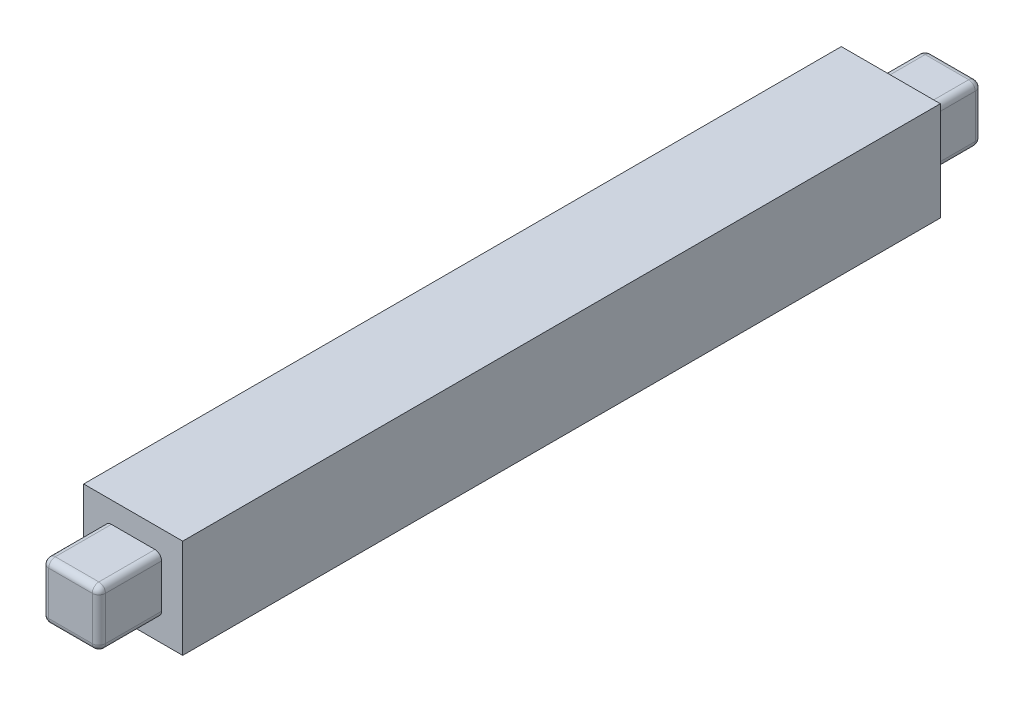
ISO-10303-21;
HEADER;
FILE_DESCRIPTION(('STEP AP214'),'2;1');
FILE_NAME('part.step','',(''),(''),'','','');
FILE_SCHEMA(('AUTOMOTIVE_DESIGN { 1 0 10303 214 1 1 1 1 }'));
ENDSEC;
DATA;
#1=APPLICATION_CONTEXT('core data for automotive mechanical design processes');
#2=APPLICATION_PROTOCOL_DEFINITION('international standard','automotive_design',2000,#1);
#3=PRODUCT_CONTEXT('',#1,'mechanical');
#4=PRODUCT('Part','Part','',(#3));
#5=PRODUCT_RELATED_PRODUCT_CATEGORY('part','',(#4));
#6=PRODUCT_DEFINITION_FORMATION('','',#4);
#7=PRODUCT_DEFINITION_CONTEXT('part definition',#1,'design');
#8=PRODUCT_DEFINITION('design','',#6,#7);
#9=PRODUCT_DEFINITION_SHAPE('','',#8);
#10=(LENGTH_UNIT() NAMED_UNIT(*) SI_UNIT(.MILLI.,.METRE.));
#11=(NAMED_UNIT(*) PLANE_ANGLE_UNIT() SI_UNIT($,.RADIAN.));
#12=(NAMED_UNIT(*) SI_UNIT($,.STERADIAN.) SOLID_ANGLE_UNIT());
#13=UNCERTAINTY_MEASURE_WITH_UNIT(LENGTH_MEASURE(1.E-05),#10,'distance_accuracy_value','');
#14=(GEOMETRIC_REPRESENTATION_CONTEXT(3) GLOBAL_UNCERTAINTY_ASSIGNED_CONTEXT((#13)) GLOBAL_UNIT_ASSIGNED_CONTEXT((#10,
#11,#12)) REPRESENTATION_CONTEXT('',''));
#15=CARTESIAN_POINT('',(0.,0.,0.));
#16=DIRECTION('',(0.,0.,1.));
#17=DIRECTION('',(1.,0.,0.));
#18=AXIS2_PLACEMENT_3D('',#15,#16,#17);
#19=CARTESIAN_POINT('',(345.,-349.404691512674,22.4));
#20=DIRECTION('',(0.,0.,-1.));
#21=DIRECTION('',(-1.,0.,0.));
#22=AXIS2_PLACEMENT_3D('',#19,#20,#21);
#23=PLANE('',#22);
#24=DIRECTION('',(-1.,0.,0.));
#25=VECTOR('',#24,1.);
#26=CARTESIAN_POINT('',(345.,-328.191488077077,22.4));
#27=LINE('',#26,#25);
#28=CARTESIAN_POINT('',(360.,-328.191488077077,22.4));
#29=VERTEX_POINT('',#28);
#30=CARTESIAN_POINT('',(345.,-328.191488077077,22.4));
#31=VERTEX_POINT('',#30);
#32=EDGE_CURVE('E300',#29,#31,#27,.T.);
#33=ORIENTED_EDGE('',*,*,#32,.F.);
#34=DIRECTION('',(0.,-1.,0.));
#35=VECTOR('',#34,1.);
#36=CARTESIAN_POINT('',(360.,-313.191488077077,22.4));
#37=LINE('',#36,#35);
#38=CARTESIAN_POINT('',(360.,-313.191488077077,22.4));
#39=VERTEX_POINT('',#38);
#40=EDGE_CURVE('E296',#39,#29,#37,.T.);
#41=ORIENTED_EDGE('',*,*,#40,.F.);
#42=DIRECTION('',(1.,0.,0.));
#43=VECTOR('',#42,1.);
#44=CARTESIAN_POINT('',(345.,-313.191488077077,22.4));
#45=LINE('',#44,#43);
#46=CARTESIAN_POINT('',(345.,-313.191488077077,22.4));
#47=VERTEX_POINT('',#46);
#48=EDGE_CURVE('E301',#47,#39,#45,.T.);
#49=ORIENTED_EDGE('',*,*,#48,.F.);
#50=DIRECTION('',(0.,1.,0.));
#51=VECTOR('',#50,1.);
#52=CARTESIAN_POINT('',(345.,-313.191488077077,22.4));
#53=LINE('',#52,#51);
#54=EDGE_CURVE('E305',#31,#47,#53,.T.);
#55=ORIENTED_EDGE('',*,*,#54,.F.);
#56=EDGE_LOOP('',(#33,#41,#49,#55));
#57=FACE_BOUND('',#56,.T.);
#58=CARTESIAN_POINT('',(349.2,-323.991488077077,22.4));
#59=DIRECTION('',(0.,0.,1.));
#60=DIRECTION('',(1.,0.,0.));
#61=AXIS2_PLACEMENT_3D('',#58,#59,#60);
#62=CIRCLE('',#61,1.);
#63=CARTESIAN_POINT('',(348.2,-323.991488077077,22.4));
#64=VERTEX_POINT('',#63);
#65=CARTESIAN_POINT('',(349.2,-324.991488077077,22.4));
#66=VERTEX_POINT('',#65);
#67=EDGE_CURVE('E230',#64,#66,#62,.T.);
#68=ORIENTED_EDGE('',*,*,#67,.F.);
#69=DIRECTION('',(0.,-1.,0.));
#70=VECTOR('',#69,1.);
#71=CARTESIAN_POINT('',(348.2,-317.391488077077,22.4));
#72=LINE('',#71,#70);
#73=CARTESIAN_POINT('',(348.2,-317.391488077077,22.4));
#74=VERTEX_POINT('',#73);
#75=EDGE_CURVE('E492',#74,#64,#72,.T.);
#76=ORIENTED_EDGE('',*,*,#75,.F.);
#77=CARTESIAN_POINT('',(349.2,-317.391488077077,22.4));
#78=DIRECTION('',(0.,0.,1.));
#79=DIRECTION('',(1.,0.,0.));
#80=AXIS2_PLACEMENT_3D('',#77,#78,#79);
#81=CIRCLE('',#80,1.);
#82=CARTESIAN_POINT('',(349.2,-316.391488077077,22.4));
#83=VERTEX_POINT('',#82);
#84=EDGE_CURVE('E496',#83,#74,#81,.T.);
#85=ORIENTED_EDGE('',*,*,#84,.F.);
#86=DIRECTION('',(-1.,0.,0.));
#87=VECTOR('',#86,1.);
#88=CARTESIAN_POINT('',(355.8,-316.391488077077,22.4));
#89=LINE('',#88,#87);
#90=CARTESIAN_POINT('',(355.8,-316.391488077077,22.4));
#91=VERTEX_POINT('',#90);
#92=EDGE_CURVE('E500',#91,#83,#89,.T.);
#93=ORIENTED_EDGE('',*,*,#92,.F.);
#94=CARTESIAN_POINT('',(355.8,-317.391488077077,22.4));
#95=DIRECTION('',(0.,0.,1.));
#96=DIRECTION('',(1.,0.,0.));
#97=AXIS2_PLACEMENT_3D('',#94,#95,#96);
#98=CIRCLE('',#97,1.);
#99=CARTESIAN_POINT('',(356.8,-317.391488077077,22.4));
#100=VERTEX_POINT('',#99);
#101=EDGE_CURVE('E504',#100,#91,#98,.T.);
#102=ORIENTED_EDGE('',*,*,#101,.F.);
#103=DIRECTION('',(0.,1.,0.));
#104=VECTOR('',#103,1.);
#105=CARTESIAN_POINT('',(356.8,-323.991488077077,22.4));
#106=LINE('',#105,#104);
#107=CARTESIAN_POINT('',(356.8,-323.991488077077,22.4));
#108=VERTEX_POINT('',#107);
#109=EDGE_CURVE('E224',#108,#100,#106,.T.);
#110=ORIENTED_EDGE('',*,*,#109,.F.);
#111=CARTESIAN_POINT('',(355.8,-323.991488077077,22.4));
#112=DIRECTION('',(0.,0.,1.));
#113=DIRECTION('',(1.,0.,0.));
#114=AXIS2_PLACEMENT_3D('',#111,#112,#113);
#115=CIRCLE('',#114,1.);
#116=CARTESIAN_POINT('',(355.8,-324.991488077077,22.4));
#117=VERTEX_POINT('',#116);
#118=EDGE_CURVE('E206',#117,#108,#115,.T.);
#119=ORIENTED_EDGE('',*,*,#118,.F.);
#120=DIRECTION('',(1.,0.,0.));
#121=VECTOR('',#120,1.);
#122=CARTESIAN_POINT('',(349.2,-324.991488077077,22.4));
#123=LINE('',#122,#121);
#124=EDGE_CURVE('E220',#66,#117,#123,.T.);
#125=ORIENTED_EDGE('',*,*,#124,.F.);
#126=EDGE_LOOP('',(#68,#76,#85,#93,#102,#110,#119,#125));
#127=FACE_BOUND('',#126,.T.);
#128=ADVANCED_FACE('F39',(#57,#127),#23,.F.);
#129=CARTESIAN_POINT('',(0.,0.,-92.4));
#130=DIRECTION('',(0.,0.,1.));
#131=DIRECTION('',(1.,0.,0.));
#132=AXIS2_PLACEMENT_3D('',#129,#130,#131);
#133=PLANE('',#132);
#134=DIRECTION('',(0.,-1.,0.));
#135=VECTOR('',#134,1.);
#136=CARTESIAN_POINT('',(345.,-313.191488077077,-92.4));
#137=LINE('',#136,#135);
#138=CARTESIAN_POINT('',(345.,-313.191488077077,-92.4));
#139=VERTEX_POINT('',#138);
#140=CARTESIAN_POINT('',(345.,-328.191488077077,-92.4));
#141=VERTEX_POINT('',#140);
#142=EDGE_CURVE('E295',#139,#141,#137,.T.);
#143=ORIENTED_EDGE('',*,*,#142,.F.);
#144=DIRECTION('',(-1.,0.,0.));
#145=VECTOR('',#144,1.);
#146=CARTESIAN_POINT('',(345.,-313.191488077077,-92.4));
#147=LINE('',#146,#145);
#148=CARTESIAN_POINT('',(360.,-313.191488077077,-92.4));
#149=VERTEX_POINT('',#148);
#150=EDGE_CURVE('E321',#149,#139,#147,.T.);
#151=ORIENTED_EDGE('',*,*,#150,.F.);
#152=DIRECTION('',(0.,1.,0.));
#153=VECTOR('',#152,1.);
#154=CARTESIAN_POINT('',(360.,-313.191488077077,-92.4));
#155=LINE('',#154,#153);
#156=CARTESIAN_POINT('',(360.,-328.191488077077,-92.4));
#157=VERTEX_POINT('',#156);
#158=EDGE_CURVE('E317',#157,#149,#155,.T.);
#159=ORIENTED_EDGE('',*,*,#158,.F.);
#160=DIRECTION('',(1.,0.,0.));
#161=VECTOR('',#160,1.);
#162=CARTESIAN_POINT('',(345.,-328.191488077077,-92.4));
#163=LINE('',#162,#161);
#164=EDGE_CURVE('E313',#141,#157,#163,.T.);
#165=ORIENTED_EDGE('',*,*,#164,.F.);
#166=EDGE_LOOP('',(#143,#151,#159,#165));
#167=FACE_BOUND('',#166,.T.);
#168=CARTESIAN_POINT('',(349.2,-317.391488077077,-92.4));
#169=DIRECTION('',(0.,0.,-1.));
#170=DIRECTION('',(1.,0.,0.));
#171=AXIS2_PLACEMENT_3D('',#168,#169,#170);
#172=CIRCLE('',#171,1.);
#173=CARTESIAN_POINT('',(348.2,-317.391488077077,-92.4));
#174=VERTEX_POINT('',#173);
#175=CARTESIAN_POINT('',(349.2,-316.391488077077,-92.4));
#176=VERTEX_POINT('',#175);
#177=EDGE_CURVE('E238',#174,#176,#172,.T.);
#178=ORIENTED_EDGE('',*,*,#177,.F.);
#179=DIRECTION('',(0.,1.,0.));
#180=VECTOR('',#179,1.);
#181=CARTESIAN_POINT('',(348.2,-323.991488077077,-92.4));
#182=LINE('',#181,#180);
#183=CARTESIAN_POINT('',(348.2,-323.991488077077,-92.4));
#184=VERTEX_POINT('',#183);
#185=EDGE_CURVE('E267',#184,#174,#182,.T.);
#186=ORIENTED_EDGE('',*,*,#185,.F.);
#187=CARTESIAN_POINT('',(349.2,-323.991488077077,-92.4));
#188=DIRECTION('',(0.,0.,-1.));
#189=DIRECTION('',(1.,0.,0.));
#190=AXIS2_PLACEMENT_3D('',#187,#188,#189);
#191=CIRCLE('',#190,1.);
#192=CARTESIAN_POINT('',(349.2,-324.991488077077,-92.4));
#193=VERTEX_POINT('',#192);
#194=EDGE_CURVE('E263',#193,#184,#191,.T.);
#195=ORIENTED_EDGE('',*,*,#194,.F.);
#196=DIRECTION('',(-1.,0.,0.));
#197=VECTOR('',#196,1.);
#198=CARTESIAN_POINT('',(355.8,-324.991488077077,-92.4));
#199=LINE('',#198,#197);
#200=CARTESIAN_POINT('',(355.8,-324.991488077077,-92.4));
#201=VERTEX_POINT('',#200);
#202=EDGE_CURVE('E259',#201,#193,#199,.T.);
#203=ORIENTED_EDGE('',*,*,#202,.F.);
#204=CARTESIAN_POINT('',(355.8,-323.991488077077,-92.4));
#205=DIRECTION('',(0.,0.,-1.));
#206=DIRECTION('',(-1.,0.,0.));
#207=AXIS2_PLACEMENT_3D('',#204,#205,#206);
#208=CIRCLE('',#207,1.);
#209=CARTESIAN_POINT('',(356.8,-323.991488077077,-92.4));
#210=VERTEX_POINT('',#209);
#211=EDGE_CURVE('E255',#210,#201,#208,.T.);
#212=ORIENTED_EDGE('',*,*,#211,.F.);
#213=DIRECTION('',(0.,-1.,0.));
#214=VECTOR('',#213,1.);
#215=CARTESIAN_POINT('',(356.8,-317.391488077077,-92.4));
#216=LINE('',#215,#214);
#217=CARTESIAN_POINT('',(356.8,-317.391488077077,-92.4));
#218=VERTEX_POINT('',#217);
#219=EDGE_CURVE('E251',#218,#210,#216,.T.);
#220=ORIENTED_EDGE('',*,*,#219,.F.);
#221=CARTESIAN_POINT('',(355.8,-317.391488077077,-92.4));
#222=DIRECTION('',(0.,0.,-1.));
#223=DIRECTION('',(1.,0.,0.));
#224=AXIS2_PLACEMENT_3D('',#221,#222,#223);
#225=CIRCLE('',#224,1.);
#226=CARTESIAN_POINT('',(355.8,-316.391488077077,-92.4));
#227=VERTEX_POINT('',#226);
#228=EDGE_CURVE('E247',#227,#218,#225,.T.);
#229=ORIENTED_EDGE('',*,*,#228,.F.);
#230=DIRECTION('',(1.,0.,0.));
#231=VECTOR('',#230,1.);
#232=CARTESIAN_POINT('',(349.2,-316.391488077077,-92.4));
#233=LINE('',#232,#231);
#234=EDGE_CURVE('E242',#176,#227,#233,.T.);
#235=ORIENTED_EDGE('',*,*,#234,.F.);
#236=EDGE_LOOP('',(#178,#186,#195,#203,#212,#220,#229,#235));
#237=FACE_BOUND('',#236,.T.);
#238=ADVANCED_FACE('F555',(#167,#237),#133,.F.);
#239=CARTESIAN_POINT('',(345.,-313.191488077077,43.6132034355964));
#240=DIRECTION('',(0.,-1.,0.));
#241=DIRECTION('',(0.,0.,-1.));
#242=AXIS2_PLACEMENT_3D('',#239,#240,#241);
#243=PLANE('',#242);
#244=DIRECTION('',(0.,0.,-1.));
#245=VECTOR('',#244,1.);
#246=CARTESIAN_POINT('',(345.,-313.191488077077,43.6132034355964));
#247=LINE('',#246,#245);
#248=EDGE_CURVE('E325',#47,#139,#247,.T.);
#249=ORIENTED_EDGE('',*,*,#248,.F.);
#250=ORIENTED_EDGE('',*,*,#48,.T.);
#251=DIRECTION('',(0.,0.,-1.));
#252=VECTOR('',#251,1.);
#253=CARTESIAN_POINT('',(360.,-313.191488077077,43.6132034355964));
#254=LINE('',#253,#252);
#255=EDGE_CURVE('E328',#39,#149,#254,.T.);
#256=ORIENTED_EDGE('',*,*,#255,.T.);
#257=ORIENTED_EDGE('',*,*,#150,.T.);
#258=EDGE_LOOP('',(#249,#250,#256,#257));
#259=FACE_BOUND('',#258,.T.);
#260=ADVANCED_FACE('F561',(#259),#243,.F.);
#261=CARTESIAN_POINT('',(360.,-313.191488077077,43.6132034355964));
#262=DIRECTION('',(-1.,0.,0.));
#263=DIRECTION('',(0.,0.,1.));
#264=AXIS2_PLACEMENT_3D('',#261,#262,#263);
#265=PLANE('',#264);
#266=ORIENTED_EDGE('',*,*,#255,.F.);
#267=ORIENTED_EDGE('',*,*,#40,.T.);
#268=DIRECTION('',(0.,0.,-1.));
#269=VECTOR('',#268,1.);
#270=CARTESIAN_POINT('',(360.,-328.191488077077,43.6132034355964));
#271=LINE('',#270,#269);
#272=EDGE_CURVE('E331',#29,#157,#271,.T.);
#273=ORIENTED_EDGE('',*,*,#272,.T.);
#274=ORIENTED_EDGE('',*,*,#158,.T.);
#275=EDGE_LOOP('',(#266,#267,#273,#274));
#276=FACE_BOUND('',#275,.T.);
#277=ADVANCED_FACE('F570',(#276),#265,.F.);
#278=CARTESIAN_POINT('',(345.,-328.191488077077,43.6132034355964));
#279=DIRECTION('',(0.,1.,0.));
#280=DIRECTION('',(0.,0.,1.));
#281=AXIS2_PLACEMENT_3D('',#278,#279,#280);
#282=PLANE('',#281);
#283=ORIENTED_EDGE('',*,*,#272,.F.);
#284=ORIENTED_EDGE('',*,*,#32,.T.);
#285=DIRECTION('',(0.,0.,-1.));
#286=VECTOR('',#285,1.);
#287=CARTESIAN_POINT('',(345.,-328.191488077077,43.6132034355964));
#288=LINE('',#287,#286);
#289=EDGE_CURVE('E334',#31,#141,#288,.T.);
#290=ORIENTED_EDGE('',*,*,#289,.T.);
#291=ORIENTED_EDGE('',*,*,#164,.T.);
#292=EDGE_LOOP('',(#283,#284,#290,#291));
#293=FACE_BOUND('',#292,.T.);
#294=ADVANCED_FACE('F574',(#293),#282,.F.);
#295=CARTESIAN_POINT('',(345.,-313.191488077077,43.6132034355964));
#296=DIRECTION('',(1.,0.,0.));
#297=DIRECTION('',(0.,0.,-1.));
#298=AXIS2_PLACEMENT_3D('',#295,#296,#297);
#299=PLANE('',#298);
#300=ORIENTED_EDGE('',*,*,#289,.F.);
#301=ORIENTED_EDGE('',*,*,#54,.T.);
#302=ORIENTED_EDGE('',*,*,#248,.T.);
#303=ORIENTED_EDGE('',*,*,#142,.T.);
#304=EDGE_LOOP('',(#300,#301,#302,#303));
#305=FACE_BOUND('',#304,.T.);
#306=ADVANCED_FACE('F578',(#305),#299,.F.);
#307=CARTESIAN_POINT('',(349.2,-317.391488077077,-101.9));
#308=DIRECTION('',(0.,0.,1.));
#309=DIRECTION('',(1.,0.,0.));
#310=AXIS2_PLACEMENT_3D('',#307,#308,#309);
#311=CYLINDRICAL_SURFACE('',#310,1.);
#312=DIRECTION('',(0.,0.,1.));
#313=VECTOR('',#312,1.);
#314=CARTESIAN_POINT('',(349.2,-316.391488077077,-101.9));
#315=LINE('',#314,#313);
#316=CARTESIAN_POINT('',(349.2,-316.391488077077,-100.9));
#317=VERTEX_POINT('',#316);
#318=EDGE_CURVE('E292',#317,#176,#315,.T.);
#319=ORIENTED_EDGE('',*,*,#318,.F.);
#320=CARTESIAN_POINT('',(349.2,-317.391488077077,-100.9));
#321=DIRECTION('',(0.,0.,1.));
#322=DIRECTION('',(1.,0.,0.));
#323=AXIS2_PLACEMENT_3D('',#320,#321,#322);
#324=CIRCLE('',#323,1.);
#325=CARTESIAN_POINT('',(348.2,-317.391488077077,-100.9));
#326=VERTEX_POINT('',#325);
#327=EDGE_CURVE('E309',#317,#326,#324,.T.);
#328=ORIENTED_EDGE('',*,*,#327,.T.);
#329=DIRECTION('',(0.,0.,1.));
#330=VECTOR('',#329,1.);
#331=CARTESIAN_POINT('',(348.2,-317.391488077077,-101.9));
#332=LINE('',#331,#330);
#333=EDGE_CURVE('E271',#326,#174,#332,.T.);
#334=ORIENTED_EDGE('',*,*,#333,.T.);
#335=ORIENTED_EDGE('',*,*,#177,.T.);
#336=EDGE_LOOP('',(#319,#328,#334,#335));
#337=FACE_BOUND('',#336,.T.);
#338=ADVANCED_FACE('F565',(#337),#311,.T.);
#339=CARTESIAN_POINT('',(349.2,-316.391488077077,-101.9));
#340=DIRECTION('',(0.,-1.,0.));
#341=DIRECTION('',(0.,0.,-1.));
#342=AXIS2_PLACEMENT_3D('',#339,#340,#341);
#343=PLANE('',#342);
#344=DIRECTION('',(0.,0.,1.));
#345=VECTOR('',#344,1.);
#346=CARTESIAN_POINT('',(355.8,-316.391488077077,-101.9));
#347=LINE('',#346,#345);
#348=CARTESIAN_POINT('',(355.8,-316.391488077077,-100.9));
#349=VERTEX_POINT('',#348);
#350=EDGE_CURVE('E289',#349,#227,#347,.T.);
#351=ORIENTED_EDGE('',*,*,#350,.F.);
#352=DIRECTION('',(1.,0.,0.));
#353=VECTOR('',#352,1.);
#354=CARTESIAN_POINT('',(349.2,-316.391488077077,-100.9));
#355=LINE('',#354,#353);
#356=EDGE_CURVE('E374',#349,#317,#355,.F.);
#357=ORIENTED_EDGE('',*,*,#356,.T.);
#358=ORIENTED_EDGE('',*,*,#318,.T.);
#359=ORIENTED_EDGE('',*,*,#234,.T.);
#360=EDGE_LOOP('',(#351,#357,#358,#359));
#361=FACE_BOUND('',#360,.T.);
#362=ADVANCED_FACE('F642',(#361),#343,.F.);
#363=CARTESIAN_POINT('',(355.8,-317.391488077077,-101.9));
#364=DIRECTION('',(0.,0.,1.));
#365=DIRECTION('',(1.,0.,0.));
#366=AXIS2_PLACEMENT_3D('',#363,#364,#365);
#367=CYLINDRICAL_SURFACE('',#366,1.);
#368=DIRECTION('',(0.,0.,1.));
#369=VECTOR('',#368,1.);
#370=CARTESIAN_POINT('',(356.8,-317.391488077077,-101.9));
#371=LINE('',#370,#369);
#372=CARTESIAN_POINT('',(356.8,-317.391488077077,-100.9));
#373=VERTEX_POINT('',#372);
#374=EDGE_CURVE('E286',#373,#218,#371,.T.);
#375=ORIENTED_EDGE('',*,*,#374,.F.);
#376=CARTESIAN_POINT('',(355.8,-317.391488077077,-100.9));
#377=DIRECTION('',(0.,0.,1.));
#378=DIRECTION('',(1.,0.,0.));
#379=AXIS2_PLACEMENT_3D('',#376,#377,#378);
#380=CIRCLE('',#379,1.);
#381=EDGE_CURVE('E371',#373,#349,#380,.T.);
#382=ORIENTED_EDGE('',*,*,#381,.T.);
#383=ORIENTED_EDGE('',*,*,#350,.T.);
#384=ORIENTED_EDGE('',*,*,#228,.T.);
#385=EDGE_LOOP('',(#375,#382,#383,#384));
#386=FACE_BOUND('',#385,.T.);
#387=ADVANCED_FACE('F634',(#386),#367,.T.);
#388=CARTESIAN_POINT('',(356.8,-317.391488077077,-101.9));
#389=DIRECTION('',(-1.,0.,0.));
#390=DIRECTION('',(0.,0.,1.));
#391=AXIS2_PLACEMENT_3D('',#388,#389,#390);
#392=PLANE('',#391);
#393=DIRECTION('',(0.,0.,1.));
#394=VECTOR('',#393,1.);
#395=CARTESIAN_POINT('',(356.8,-323.991488077077,-101.9));
#396=LINE('',#395,#394);
#397=CARTESIAN_POINT('',(356.8,-323.991488077077,-100.9));
#398=VERTEX_POINT('',#397);
#399=EDGE_CURVE('E283',#398,#210,#396,.T.);
#400=ORIENTED_EDGE('',*,*,#399,.F.);
#401=DIRECTION('',(0.,-1.,0.));
#402=VECTOR('',#401,1.);
#403=CARTESIAN_POINT('',(356.8,-317.391488077077,-100.9));
#404=LINE('',#403,#402);
#405=EDGE_CURVE('E368',#398,#373,#404,.F.);
#406=ORIENTED_EDGE('',*,*,#405,.T.);
#407=ORIENTED_EDGE('',*,*,#374,.T.);
#408=ORIENTED_EDGE('',*,*,#219,.T.);
#409=EDGE_LOOP('',(#400,#406,#407,#408));
#410=FACE_BOUND('',#409,.T.);
#411=ADVANCED_FACE('F631',(#410),#392,.F.);
#412=CARTESIAN_POINT('',(355.8,-323.991488077077,-101.9));
#413=DIRECTION('',(0.,0.,1.));
#414=DIRECTION('',(1.,0.,0.));
#415=AXIS2_PLACEMENT_3D('',#412,#413,#414);
#416=CYLINDRICAL_SURFACE('',#415,1.);
#417=DIRECTION('',(0.,0.,1.));
#418=VECTOR('',#417,1.);
#419=CARTESIAN_POINT('',(355.8,-324.991488077077,-101.9));
#420=LINE('',#419,#418);
#421=CARTESIAN_POINT('',(355.8,-324.991488077077,-100.9));
#422=VERTEX_POINT('',#421);
#423=EDGE_CURVE('E280',#422,#201,#420,.T.);
#424=ORIENTED_EDGE('',*,*,#423,.F.);
#425=CARTESIAN_POINT('',(355.8,-323.991488077077,-100.9));
#426=DIRECTION('',(0.,0.,1.));
#427=DIRECTION('',(1.,0.,0.));
#428=AXIS2_PLACEMENT_3D('',#425,#426,#427);
#429=CIRCLE('',#428,1.);
#430=EDGE_CURVE('E365',#422,#398,#429,.T.);
#431=ORIENTED_EDGE('',*,*,#430,.T.);
#432=ORIENTED_EDGE('',*,*,#399,.T.);
#433=ORIENTED_EDGE('',*,*,#211,.T.);
#434=EDGE_LOOP('',(#424,#431,#432,#433));
#435=FACE_BOUND('',#434,.T.);
#436=ADVANCED_FACE('F670',(#435),#416,.T.);
#437=CARTESIAN_POINT('',(355.8,-324.991488077077,-101.9));
#438=DIRECTION('',(0.,1.,0.));
#439=DIRECTION('',(0.,0.,1.));
#440=AXIS2_PLACEMENT_3D('',#437,#438,#439);
#441=PLANE('',#440);
#442=DIRECTION('',(0.,0.,1.));
#443=VECTOR('',#442,1.);
#444=CARTESIAN_POINT('',(349.2,-324.991488077077,-101.9));
#445=LINE('',#444,#443);
#446=CARTESIAN_POINT('',(349.2,-324.991488077077,-100.9));
#447=VERTEX_POINT('',#446);
#448=EDGE_CURVE('E277',#447,#193,#445,.T.);
#449=ORIENTED_EDGE('',*,*,#448,.F.);
#450=DIRECTION('',(-1.,0.,0.));
#451=VECTOR('',#450,1.);
#452=CARTESIAN_POINT('',(355.8,-324.991488077077,-100.9));
#453=LINE('',#452,#451);
#454=EDGE_CURVE('E362',#447,#422,#453,.F.);
#455=ORIENTED_EDGE('',*,*,#454,.T.);
#456=ORIENTED_EDGE('',*,*,#423,.T.);
#457=ORIENTED_EDGE('',*,*,#202,.T.);
#458=EDGE_LOOP('',(#449,#455,#456,#457));
#459=FACE_BOUND('',#458,.T.);
#460=ADVANCED_FACE('F667',(#459),#441,.F.);
#461=CARTESIAN_POINT('',(349.2,-323.991488077077,-101.9));
#462=DIRECTION('',(0.,0.,1.));
#463=DIRECTION('',(1.,0.,0.));
#464=AXIS2_PLACEMENT_3D('',#461,#462,#463);
#465=CYLINDRICAL_SURFACE('',#464,1.);
#466=DIRECTION('',(0.,0.,1.));
#467=VECTOR('',#466,1.);
#468=CARTESIAN_POINT('',(348.2,-323.991488077077,-101.9));
#469=LINE('',#468,#467);
#470=CARTESIAN_POINT('',(348.2,-323.991488077077,-100.9));
#471=VERTEX_POINT('',#470);
#472=EDGE_CURVE('E274',#471,#184,#469,.T.);
#473=ORIENTED_EDGE('',*,*,#472,.F.);
#474=CARTESIAN_POINT('',(349.2,-323.991488077077,-100.9));
#475=DIRECTION('',(0.,0.,1.));
#476=DIRECTION('',(1.,0.,0.));
#477=AXIS2_PLACEMENT_3D('',#474,#475,#476);
#478=CIRCLE('',#477,1.);
#479=EDGE_CURVE('E359',#471,#447,#478,.T.);
#480=ORIENTED_EDGE('',*,*,#479,.T.);
#481=ORIENTED_EDGE('',*,*,#448,.T.);
#482=ORIENTED_EDGE('',*,*,#194,.T.);
#483=EDGE_LOOP('',(#473,#480,#481,#482));
#484=FACE_BOUND('',#483,.T.);
#485=ADVANCED_FACE('F661',(#484),#465,.T.);
#486=CARTESIAN_POINT('',(348.2,-323.991488077077,-101.9));
#487=DIRECTION('',(1.,0.,0.));
#488=DIRECTION('',(0.,0.,-1.));
#489=AXIS2_PLACEMENT_3D('',#486,#487,#488);
#490=PLANE('',#489);
#491=ORIENTED_EDGE('',*,*,#333,.F.);
#492=DIRECTION('',(0.,1.,0.));
#493=VECTOR('',#492,1.);
#494=CARTESIAN_POINT('',(348.2,-323.991488077077,-100.9));
#495=LINE('',#494,#493);
#496=EDGE_CURVE('E356',#326,#471,#495,.F.);
#497=ORIENTED_EDGE('',*,*,#496,.T.);
#498=ORIENTED_EDGE('',*,*,#472,.T.);
#499=ORIENTED_EDGE('',*,*,#185,.T.);
#500=EDGE_LOOP('',(#491,#497,#498,#499));
#501=FACE_BOUND('',#500,.T.);
#502=ADVANCED_FACE('F617',(#501),#490,.F.);
#503=CARTESIAN_POINT('',(349.2,-317.391488077077,-101.9));
#504=DIRECTION('',(0.,0.,1.));
#505=DIRECTION('',(1.,0.,0.));
#506=AXIS2_PLACEMENT_3D('',#503,#504,#505);
#507=PLANE('',#506);
#508=DIRECTION('',(-1.,0.,0.));
#509=VECTOR('',#508,1.);
#510=CARTESIAN_POINT('',(349.2,-323.991488077077,-101.9));
#511=LINE('',#510,#509);
#512=CARTESIAN_POINT('',(355.8,-323.991488077077,-101.9));
#513=VERTEX_POINT('',#512);
#514=CARTESIAN_POINT('',(349.2,-323.991488077077,-101.9));
#515=VERTEX_POINT('',#514);
#516=EDGE_CURVE('E349',#513,#515,#511,.T.);
#517=ORIENTED_EDGE('',*,*,#516,.T.);
#518=DIRECTION('',(0.,1.,0.));
#519=VECTOR('',#518,1.);
#520=CARTESIAN_POINT('',(349.2,-317.391488077077,-101.9));
#521=LINE('',#520,#519);
#522=CARTESIAN_POINT('',(349.2,-317.391488077077,-101.9));
#523=VERTEX_POINT('',#522);
#524=EDGE_CURVE('E352',#515,#523,#521,.T.);
#525=ORIENTED_EDGE('',*,*,#524,.T.);
#526=DIRECTION('',(1.,0.,0.));
#527=VECTOR('',#526,1.);
#528=CARTESIAN_POINT('',(349.2,-317.391488077077,-101.9));
#529=LINE('',#528,#527);
#530=CARTESIAN_POINT('',(355.8,-317.391488077077,-101.9));
#531=VERTEX_POINT('',#530);
#532=EDGE_CURVE('E343',#523,#531,#529,.T.);
#533=ORIENTED_EDGE('',*,*,#532,.T.);
#534=DIRECTION('',(0.,-1.,0.));
#535=VECTOR('',#534,1.);
#536=CARTESIAN_POINT('',(355.8,-317.391488077077,-101.9));
#537=LINE('',#536,#535);
#538=EDGE_CURVE('E346',#531,#513,#537,.T.);
#539=ORIENTED_EDGE('',*,*,#538,.T.);
#540=EDGE_LOOP('',(#517,#525,#533,#539));
#541=FACE_BOUND('',#540,.T.);
#542=ADVANCED_FACE('F612',(#541),#507,.F.);
#543=CARTESIAN_POINT('',(355.8,-323.991488077077,-100.9));
#544=DIRECTION('',(0.,0.,1.));
#545=DIRECTION('',(1.,0.,0.));
#546=AXIS2_PLACEMENT_3D('',#543,#544,#545);
#547=SPHERICAL_SURFACE('',#546,1.);
#548=CARTESIAN_POINT('',(355.8,-323.991488077077,-100.9));
#549=DIRECTION('',(0.,1.,0.));
#550=DIRECTION('',(0.,0.,1.));
#551=AXIS2_PLACEMENT_3D('',#548,#549,#550);
#552=CIRCLE('',#551,1.);
#553=EDGE_CURVE('E399',#398,#513,#552,.T.);
#554=ORIENTED_EDGE('',*,*,#553,.F.);
#555=ORIENTED_EDGE('',*,*,#430,.F.);
#556=CARTESIAN_POINT('',(355.8,-323.991488077077,-100.9));
#557=DIRECTION('',(-1.,0.,0.));
#558=DIRECTION('',(0.,0.,1.));
#559=AXIS2_PLACEMENT_3D('',#556,#557,#558);
#560=CIRCLE('',#559,1.);
#561=EDGE_CURVE('E243',#513,#422,#560,.T.);
#562=ORIENTED_EDGE('',*,*,#561,.F.);
#563=EDGE_LOOP('',(#554,#555,#562));
#564=FACE_BOUND('',#563,.T.);
#565=ADVANCED_FACE('F609',(#564),#547,.T.);
#566=CARTESIAN_POINT('',(349.2,-323.991488077077,-100.9));
#567=DIRECTION('',(-1.,0.,0.));
#568=DIRECTION('',(0.,0.,1.));
#569=AXIS2_PLACEMENT_3D('',#566,#567,#568);
#570=CYLINDRICAL_SURFACE('',#569,1.);
#571=ORIENTED_EDGE('',*,*,#561,.T.);
#572=ORIENTED_EDGE('',*,*,#454,.F.);
#573=CARTESIAN_POINT('',(349.2,-323.991488077077,-100.9));
#574=DIRECTION('',(-1.,0.,0.));
#575=DIRECTION('',(0.,0.,1.));
#576=AXIS2_PLACEMENT_3D('',#573,#574,#575);
#577=CIRCLE('',#576,1.);
#578=EDGE_CURVE('E395',#515,#447,#577,.T.);
#579=ORIENTED_EDGE('',*,*,#578,.F.);
#580=ORIENTED_EDGE('',*,*,#516,.F.);
#581=EDGE_LOOP('',(#571,#572,#579,#580));
#582=FACE_BOUND('',#581,.T.);
#583=ADVANCED_FACE('F606',(#582),#570,.T.);
#584=CARTESIAN_POINT('',(355.8,-317.391488077077,-100.9));
#585=DIRECTION('',(0.,-1.,0.));
#586=DIRECTION('',(0.,0.,-1.));
#587=AXIS2_PLACEMENT_3D('',#584,#585,#586);
#588=CYLINDRICAL_SURFACE('',#587,1.);
#589=ORIENTED_EDGE('',*,*,#553,.T.);
#590=ORIENTED_EDGE('',*,*,#538,.F.);
#591=CARTESIAN_POINT('',(355.8,-317.391488077077,-100.9));
#592=DIRECTION('',(0.,1.,0.));
#593=DIRECTION('',(0.,0.,1.));
#594=AXIS2_PLACEMENT_3D('',#591,#592,#593);
#595=CIRCLE('',#594,1.);
#596=EDGE_CURVE('E391',#373,#531,#595,.T.);
#597=ORIENTED_EDGE('',*,*,#596,.F.);
#598=ORIENTED_EDGE('',*,*,#405,.F.);
#599=EDGE_LOOP('',(#589,#590,#597,#598));
#600=FACE_BOUND('',#599,.T.);
#601=ADVANCED_FACE('F602',(#600),#588,.T.);
#602=CARTESIAN_POINT('',(349.2,-323.991488077077,-100.9));
#603=DIRECTION('',(0.,0.,1.));
#604=DIRECTION('',(1.,0.,0.));
#605=AXIS2_PLACEMENT_3D('',#602,#603,#604);
#606=SPHERICAL_SURFACE('',#605,1.);
#607=ORIENTED_EDGE('',*,*,#578,.T.);
#608=ORIENTED_EDGE('',*,*,#479,.F.);
#609=CARTESIAN_POINT('',(349.2,-323.991488077077,-100.9));
#610=DIRECTION('',(0.,1.,0.));
#611=DIRECTION('',(0.,0.,1.));
#612=AXIS2_PLACEMENT_3D('',#609,#610,#611);
#613=CIRCLE('',#612,1.);
#614=EDGE_CURVE('E387',#515,#471,#613,.T.);
#615=ORIENTED_EDGE('',*,*,#614,.F.);
#616=EDGE_LOOP('',(#607,#608,#615));
#617=FACE_BOUND('',#616,.T.);
#618=ADVANCED_FACE('F598',(#617),#606,.T.);
#619=CARTESIAN_POINT('',(355.8,-317.391488077077,-100.9));
#620=DIRECTION('',(0.,0.,1.));
#621=DIRECTION('',(1.,0.,0.));
#622=AXIS2_PLACEMENT_3D('',#619,#620,#621);
#623=SPHERICAL_SURFACE('',#622,1.);
#624=ORIENTED_EDGE('',*,*,#381,.F.);
#625=ORIENTED_EDGE('',*,*,#596,.T.);
#626=CARTESIAN_POINT('',(355.8,-317.391488077077,-100.9));
#627=DIRECTION('',(-1.,0.,0.));
#628=DIRECTION('',(0.,0.,1.));
#629=AXIS2_PLACEMENT_3D('',#626,#627,#628);
#630=CIRCLE('',#629,1.);
#631=EDGE_CURVE('E383',#349,#531,#630,.T.);
#632=ORIENTED_EDGE('',*,*,#631,.F.);
#633=EDGE_LOOP('',(#624,#625,#632));
#634=FACE_BOUND('',#633,.T.);
#635=ADVANCED_FACE('F594',(#634),#623,.T.);
#636=CARTESIAN_POINT('',(349.2,-317.391488077077,-100.9));
#637=DIRECTION('',(0.,1.,0.));
#638=DIRECTION('',(0.,0.,1.));
#639=AXIS2_PLACEMENT_3D('',#636,#637,#638);
#640=CYLINDRICAL_SURFACE('',#639,1.);
#641=ORIENTED_EDGE('',*,*,#614,.T.);
#642=ORIENTED_EDGE('',*,*,#496,.F.);
#643=CARTESIAN_POINT('',(349.2,-317.391488077077,-100.9));
#644=DIRECTION('',(0.,1.,0.));
#645=DIRECTION('',(0.,0.,1.));
#646=AXIS2_PLACEMENT_3D('',#643,#644,#645);
#647=CIRCLE('',#646,1.);
#648=EDGE_CURVE('E380',#523,#326,#647,.T.);
#649=ORIENTED_EDGE('',*,*,#648,.F.);
#650=ORIENTED_EDGE('',*,*,#524,.F.);
#651=EDGE_LOOP('',(#641,#642,#649,#650));
#652=FACE_BOUND('',#651,.T.);
#653=ADVANCED_FACE('F590',(#652),#640,.T.);
#654=CARTESIAN_POINT('',(349.2,-317.391488077077,-100.9));
#655=DIRECTION('',(1.,0.,0.));
#656=DIRECTION('',(0.,0.,-1.));
#657=AXIS2_PLACEMENT_3D('',#654,#655,#656);
#658=CYLINDRICAL_SURFACE('',#657,1.);
#659=ORIENTED_EDGE('',*,*,#631,.T.);
#660=ORIENTED_EDGE('',*,*,#532,.F.);
#661=CARTESIAN_POINT('',(349.2,-317.391488077077,-100.9));
#662=DIRECTION('',(-1.,0.,0.));
#663=DIRECTION('',(0.,0.,1.));
#664=AXIS2_PLACEMENT_3D('',#661,#662,#663);
#665=CIRCLE('',#664,1.);
#666=EDGE_CURVE('E234',#317,#523,#665,.T.);
#667=ORIENTED_EDGE('',*,*,#666,.F.);
#668=ORIENTED_EDGE('',*,*,#356,.F.);
#669=EDGE_LOOP('',(#659,#660,#667,#668));
#670=FACE_BOUND('',#669,.T.);
#671=ADVANCED_FACE('F586',(#670),#658,.T.);
#672=CARTESIAN_POINT('',(349.2,-317.391488077077,-100.9));
#673=DIRECTION('',(0.,0.,1.));
#674=DIRECTION('',(1.,0.,0.));
#675=AXIS2_PLACEMENT_3D('',#672,#673,#674);
#676=SPHERICAL_SURFACE('',#675,1.);
#677=ORIENTED_EDGE('',*,*,#648,.T.);
#678=ORIENTED_EDGE('',*,*,#327,.F.);
#679=ORIENTED_EDGE('',*,*,#666,.T.);
#680=EDGE_LOOP('',(#677,#678,#679));
#681=FACE_BOUND('',#680,.T.);
#682=ADVANCED_FACE('F583',(#681),#676,.T.);
#683=CARTESIAN_POINT('',(349.2,-323.991488077077,31.9));
#684=DIRECTION('',(0.,0.,-1.));
#685=DIRECTION('',(-1.,0.,0.));
#686=AXIS2_PLACEMENT_3D('',#683,#684,#685);
#687=CYLINDRICAL_SURFACE('',#686,1.);
#688=DIRECTION('',(0.,0.,-1.));
#689=VECTOR('',#688,1.);
#690=CARTESIAN_POINT('',(349.2,-324.991488077077,31.9));
#691=LINE('',#690,#689);
#692=CARTESIAN_POINT('',(349.2,-324.991488077077,30.9));
#693=VERTEX_POINT('',#692);
#694=EDGE_CURVE('E214',#693,#66,#691,.T.);
#695=ORIENTED_EDGE('',*,*,#694,.F.);
#696=CARTESIAN_POINT('',(349.2,-323.991488077077,30.9));
#697=DIRECTION('',(0.,0.,-1.));
#698=DIRECTION('',(-1.,0.,0.));
#699=AXIS2_PLACEMENT_3D('',#696,#697,#698);
#700=CIRCLE('',#699,1.);
#701=CARTESIAN_POINT('',(348.2,-323.991488077077,30.9));
#702=VERTEX_POINT('',#701);
#703=EDGE_CURVE('E430',#693,#702,#700,.T.);
#704=ORIENTED_EDGE('',*,*,#703,.T.);
#705=DIRECTION('',(0.,0.,-1.));
#706=VECTOR('',#705,1.);
#707=CARTESIAN_POINT('',(348.2,-323.991488077077,31.9));
#708=LINE('',#707,#706);
#709=EDGE_CURVE('E489',#702,#64,#708,.T.);
#710=ORIENTED_EDGE('',*,*,#709,.T.);
#711=ORIENTED_EDGE('',*,*,#67,.T.);
#712=EDGE_LOOP('',(#695,#704,#710,#711));
#713=FACE_BOUND('',#712,.T.);
#714=ADVANCED_FACE('F527',(#713),#687,.T.);
#715=CARTESIAN_POINT('',(349.2,-324.991488077077,31.9));
#716=DIRECTION('',(0.,1.,0.));
#717=DIRECTION('',(0.,0.,1.));
#718=AXIS2_PLACEMENT_3D('',#715,#716,#717);
#719=PLANE('',#718);
#720=DIRECTION('',(0.,0.,-1.));
#721=VECTOR('',#720,1.);
#722=CARTESIAN_POINT('',(355.8,-324.991488077077,31.9));
#723=LINE('',#722,#721);
#724=CARTESIAN_POINT('',(355.8,-324.991488077077,30.9));
#725=VERTEX_POINT('',#724);
#726=EDGE_CURVE('E202',#725,#117,#723,.T.);
#727=ORIENTED_EDGE('',*,*,#726,.F.);
#728=DIRECTION('',(1.,0.,0.));
#729=VECTOR('',#728,1.);
#730=CARTESIAN_POINT('',(349.2,-324.991488077077,30.9));
#731=LINE('',#730,#729);
#732=EDGE_CURVE('E427',#725,#693,#731,.F.);
#733=ORIENTED_EDGE('',*,*,#732,.T.);
#734=ORIENTED_EDGE('',*,*,#694,.T.);
#735=ORIENTED_EDGE('',*,*,#124,.T.);
#736=EDGE_LOOP('',(#727,#733,#734,#735));
#737=FACE_BOUND('',#736,.T.);
#738=ADVANCED_FACE('F227',(#737),#719,.F.);
#739=CARTESIAN_POINT('',(355.8,-323.991488077077,31.9));
#740=DIRECTION('',(0.,0.,-1.));
#741=DIRECTION('',(-1.,0.,0.));
#742=AXIS2_PLACEMENT_3D('',#739,#740,#741);
#743=CYLINDRICAL_SURFACE('',#742,1.);
#744=DIRECTION('',(0.,0.,-1.));
#745=VECTOR('',#744,1.);
#746=CARTESIAN_POINT('',(356.8,-323.991488077077,31.9));
#747=LINE('',#746,#745);
#748=CARTESIAN_POINT('',(356.8,-323.991488077077,30.9));
#749=VERTEX_POINT('',#748);
#750=EDGE_CURVE('E213',#749,#108,#747,.T.);
#751=ORIENTED_EDGE('',*,*,#750,.F.);
#752=CARTESIAN_POINT('',(355.8,-323.991488077077,30.9));
#753=DIRECTION('',(0.,0.,-1.));
#754=DIRECTION('',(-1.,0.,0.));
#755=AXIS2_PLACEMENT_3D('',#752,#753,#754);
#756=CIRCLE('',#755,1.);
#757=EDGE_CURVE('E208',#749,#725,#756,.T.);
#758=ORIENTED_EDGE('',*,*,#757,.T.);
#759=ORIENTED_EDGE('',*,*,#726,.T.);
#760=ORIENTED_EDGE('',*,*,#118,.T.);
#761=EDGE_LOOP('',(#751,#758,#759,#760));
#762=FACE_BOUND('',#761,.T.);
#763=ADVANCED_FACE('F205',(#762),#743,.T.);
#764=CARTESIAN_POINT('',(356.8,-323.991488077077,31.9));
#765=DIRECTION('',(-1.,0.,0.));
#766=DIRECTION('',(0.,0.,1.));
#767=AXIS2_PLACEMENT_3D('',#764,#765,#766);
#768=PLANE('',#767);
#769=DIRECTION('',(0.,0.,-1.));
#770=VECTOR('',#769,1.);
#771=CARTESIAN_POINT('',(356.8,-317.391488077077,31.9));
#772=LINE('',#771,#770);
#773=CARTESIAN_POINT('',(356.8,-317.391488077077,30.9));
#774=VERTEX_POINT('',#773);
#775=EDGE_CURVE('E477',#774,#100,#772,.T.);
#776=ORIENTED_EDGE('',*,*,#775,.F.);
#777=DIRECTION('',(0.,1.,0.));
#778=VECTOR('',#777,1.);
#779=CARTESIAN_POINT('',(356.8,-323.991488077077,30.9));
#780=LINE('',#779,#778);
#781=EDGE_CURVE('E422',#774,#749,#780,.F.);
#782=ORIENTED_EDGE('',*,*,#781,.T.);
#783=ORIENTED_EDGE('',*,*,#750,.T.);
#784=ORIENTED_EDGE('',*,*,#109,.T.);
#785=EDGE_LOOP('',(#776,#782,#783,#784));
#786=FACE_BOUND('',#785,.T.);
#787=ADVANCED_FACE('F511',(#786),#768,.F.);
#788=CARTESIAN_POINT('',(355.8,-317.391488077077,31.9));
#789=DIRECTION('',(0.,0.,-1.));
#790=DIRECTION('',(-1.,0.,0.));
#791=AXIS2_PLACEMENT_3D('',#788,#789,#790);
#792=CYLINDRICAL_SURFACE('',#791,1.);
#793=DIRECTION('',(0.,0.,-1.));
#794=VECTOR('',#793,1.);
#795=CARTESIAN_POINT('',(355.8,-316.391488077077,31.9));
#796=LINE('',#795,#794);
#797=CARTESIAN_POINT('',(355.8,-316.391488077077,30.9));
#798=VERTEX_POINT('',#797);
#799=EDGE_CURVE('E480',#798,#91,#796,.T.);
#800=ORIENTED_EDGE('',*,*,#799,.F.);
#801=CARTESIAN_POINT('',(355.8,-317.391488077077,30.9));
#802=DIRECTION('',(0.,0.,-1.));
#803=DIRECTION('',(-1.,0.,0.));
#804=AXIS2_PLACEMENT_3D('',#801,#802,#803);
#805=CIRCLE('',#804,1.);
#806=EDGE_CURVE('E377',#798,#774,#805,.T.);
#807=ORIENTED_EDGE('',*,*,#806,.T.);
#808=ORIENTED_EDGE('',*,*,#775,.T.);
#809=ORIENTED_EDGE('',*,*,#101,.T.);
#810=EDGE_LOOP('',(#800,#807,#808,#809));
#811=FACE_BOUND('',#810,.T.);
#812=ADVANCED_FACE('F544',(#811),#792,.T.);
#813=CARTESIAN_POINT('',(355.8,-316.391488077077,31.9));
#814=DIRECTION('',(0.,-1.,0.));
#815=DIRECTION('',(0.,0.,-1.));
#816=AXIS2_PLACEMENT_3D('',#813,#814,#815);
#817=PLANE('',#816);
#818=DIRECTION('',(0.,0.,-1.));
#819=VECTOR('',#818,1.);
#820=CARTESIAN_POINT('',(349.2,-316.391488077077,31.9));
#821=LINE('',#820,#819);
#822=CARTESIAN_POINT('',(349.2,-316.391488077077,30.9));
#823=VERTEX_POINT('',#822);
#824=EDGE_CURVE('E483',#823,#83,#821,.T.);
#825=ORIENTED_EDGE('',*,*,#824,.F.);
#826=DIRECTION('',(-1.,0.,0.));
#827=VECTOR('',#826,1.);
#828=CARTESIAN_POINT('',(355.8,-316.391488077077,30.9));
#829=LINE('',#828,#827);
#830=EDGE_CURVE('E11',#823,#798,#829,.F.);
#831=ORIENTED_EDGE('',*,*,#830,.T.);
#832=ORIENTED_EDGE('',*,*,#799,.T.);
#833=ORIENTED_EDGE('',*,*,#92,.T.);
#834=EDGE_LOOP('',(#825,#831,#832,#833));
#835=FACE_BOUND('',#834,.T.);
#836=ADVANCED_FACE('F540',(#835),#817,.F.);
#837=CARTESIAN_POINT('',(349.2,-317.391488077077,31.9));
#838=DIRECTION('',(0.,0.,-1.));
#839=DIRECTION('',(-1.,0.,0.));
#840=AXIS2_PLACEMENT_3D('',#837,#838,#839);
#841=CYLINDRICAL_SURFACE('',#840,1.);
#842=DIRECTION('',(0.,0.,-1.));
#843=VECTOR('',#842,1.);
#844=CARTESIAN_POINT('',(348.2,-317.391488077077,31.9));
#845=LINE('',#844,#843);
#846=CARTESIAN_POINT('',(348.2,-317.391488077077,30.9));
#847=VERTEX_POINT('',#846);
#848=EDGE_CURVE('E486',#847,#74,#845,.T.);
#849=ORIENTED_EDGE('',*,*,#848,.F.);
#850=CARTESIAN_POINT('',(349.2,-317.391488077077,30.9));
#851=DIRECTION('',(0.,0.,-1.));
#852=DIRECTION('',(-1.,0.,0.));
#853=AXIS2_PLACEMENT_3D('',#850,#851,#852);
#854=CIRCLE('',#853,1.);
#855=EDGE_CURVE('E49',#847,#823,#854,.T.);
#856=ORIENTED_EDGE('',*,*,#855,.T.);
#857=ORIENTED_EDGE('',*,*,#824,.T.);
#858=ORIENTED_EDGE('',*,*,#84,.T.);
#859=EDGE_LOOP('',(#849,#856,#857,#858));
#860=FACE_BOUND('',#859,.T.);
#861=ADVANCED_FACE('F806',(#860),#841,.T.);
#862=CARTESIAN_POINT('',(348.2,-317.391488077077,31.9));
#863=DIRECTION('',(1.,0.,0.));
#864=DIRECTION('',(0.,0.,-1.));
#865=AXIS2_PLACEMENT_3D('',#862,#863,#864);
#866=PLANE('',#865);
#867=ORIENTED_EDGE('',*,*,#709,.F.);
#868=DIRECTION('',(0.,-1.,0.));
#869=VECTOR('',#868,1.);
#870=CARTESIAN_POINT('',(348.2,-317.391488077077,30.9));
#871=LINE('',#870,#869);
#872=EDGE_CURVE('E64',#702,#847,#871,.F.);
#873=ORIENTED_EDGE('',*,*,#872,.T.);
#874=ORIENTED_EDGE('',*,*,#848,.T.);
#875=ORIENTED_EDGE('',*,*,#75,.T.);
#876=EDGE_LOOP('',(#867,#873,#874,#875));
#877=FACE_BOUND('',#876,.T.);
#878=ADVANCED_FACE('F796',(#877),#866,.F.);
#879=CARTESIAN_POINT('',(349.2,-323.991488077077,31.9));
#880=DIRECTION('',(0.,0.,1.));
#881=DIRECTION('',(1.,0.,0.));
#882=AXIS2_PLACEMENT_3D('',#879,#880,#881);
#883=PLANE('',#882);
#884=DIRECTION('',(1.,0.,0.));
#885=VECTOR('',#884,1.);
#886=CARTESIAN_POINT('',(355.8,-323.991488077077,31.9));
#887=LINE('',#886,#885);
#888=CARTESIAN_POINT('',(349.2,-323.991488077077,31.9));
#889=VERTEX_POINT('',#888);
#890=CARTESIAN_POINT('',(355.8,-323.991488077077,31.9));
#891=VERTEX_POINT('',#890);
#892=EDGE_CURVE('E415',#889,#891,#887,.T.);
#893=ORIENTED_EDGE('',*,*,#892,.T.);
#894=DIRECTION('',(0.,1.,0.));
#895=VECTOR('',#894,1.);
#896=CARTESIAN_POINT('',(355.8,-317.391488077077,31.9));
#897=LINE('',#896,#895);
#898=CARTESIAN_POINT('',(355.8,-317.391488077077,31.9));
#899=VERTEX_POINT('',#898);
#900=EDGE_CURVE('E418',#891,#899,#897,.T.);
#901=ORIENTED_EDGE('',*,*,#900,.T.);
#902=DIRECTION('',(-1.,0.,0.));
#903=VECTOR('',#902,1.);
#904=CARTESIAN_POINT('',(349.2,-317.391488077077,31.9));
#905=LINE('',#904,#903);
#906=CARTESIAN_POINT('',(349.2,-317.391488077077,31.9));
#907=VERTEX_POINT('',#906);
#908=EDGE_CURVE('E409',#899,#907,#905,.T.);
#909=ORIENTED_EDGE('',*,*,#908,.T.);
#910=DIRECTION('',(0.,-1.,0.));
#911=VECTOR('',#910,1.);
#912=CARTESIAN_POINT('',(349.2,-323.991488077077,31.9));
#913=LINE('',#912,#911);
#914=EDGE_CURVE('E412',#907,#889,#913,.T.);
#915=ORIENTED_EDGE('',*,*,#914,.T.);
#916=EDGE_LOOP('',(#893,#901,#909,#915));
#917=FACE_BOUND('',#916,.T.);
#918=ADVANCED_FACE('F523',(#917),#883,.T.);
#919=CARTESIAN_POINT('',(349.2,-323.991488077077,30.9));
#920=DIRECTION('',(0.,0.,1.));
#921=DIRECTION('',(1.,0.,0.));
#922=AXIS2_PLACEMENT_3D('',#919,#920,#921);
#923=SPHERICAL_SURFACE('',#922,1.);
#924=CARTESIAN_POINT('',(349.2,-323.991488077077,30.9));
#925=DIRECTION('',(0.,1.,0.));
#926=DIRECTION('',(0.,0.,1.));
#927=AXIS2_PLACEMENT_3D('',#924,#925,#926);
#928=CIRCLE('',#927,1.);
#929=EDGE_CURVE('E458',#702,#889,#928,.T.);
#930=ORIENTED_EDGE('',*,*,#929,.F.);
#931=ORIENTED_EDGE('',*,*,#703,.F.);
#932=CARTESIAN_POINT('',(349.2,-323.991488077077,30.9));
#933=DIRECTION('',(1.,0.,0.));
#934=DIRECTION('',(0.,0.,-1.));
#935=AXIS2_PLACEMENT_3D('',#932,#933,#934);
#936=CIRCLE('',#935,1.);
#937=EDGE_CURVE('E43',#889,#693,#936,.T.);
#938=ORIENTED_EDGE('',*,*,#937,.F.);
#939=EDGE_LOOP('',(#930,#931,#938));
#940=FACE_BOUND('',#939,.T.);
#941=ADVANCED_FACE('F41',(#940),#923,.T.);
#942=CARTESIAN_POINT('',(349.2,-323.991488077077,30.9));
#943=DIRECTION('',(-1.,0.,0.));
#944=DIRECTION('',(0.,0.,1.));
#945=AXIS2_PLACEMENT_3D('',#942,#943,#944);
#946=CYLINDRICAL_SURFACE('',#945,1.);
#947=ORIENTED_EDGE('',*,*,#937,.T.);
#948=ORIENTED_EDGE('',*,*,#732,.F.);
#949=CARTESIAN_POINT('',(355.8,-323.991488077077,30.9));
#950=DIRECTION('',(1.,0.,0.));
#951=DIRECTION('',(0.,0.,-1.));
#952=AXIS2_PLACEMENT_3D('',#949,#950,#951);
#953=CIRCLE('',#952,1.);
#954=EDGE_CURVE('E455',#891,#725,#953,.T.);
#955=ORIENTED_EDGE('',*,*,#954,.F.);
#956=ORIENTED_EDGE('',*,*,#892,.F.);
#957=EDGE_LOOP('',(#947,#948,#955,#956));
#958=FACE_BOUND('',#957,.T.);
#959=ADVANCED_FACE('F524',(#958),#946,.T.);
#960=CARTESIAN_POINT('',(349.2,-323.991488077077,30.9));
#961=DIRECTION('',(0.,1.,0.));
#962=DIRECTION('',(0.,0.,1.));
#963=AXIS2_PLACEMENT_3D('',#960,#961,#962);
#964=CYLINDRICAL_SURFACE('',#963,1.);
#965=ORIENTED_EDGE('',*,*,#929,.T.);
#966=ORIENTED_EDGE('',*,*,#914,.F.);
#967=CARTESIAN_POINT('',(349.2,-317.391488077077,30.9));
#968=DIRECTION('',(0.,1.,0.));
#969=DIRECTION('',(0.,0.,1.));
#970=AXIS2_PLACEMENT_3D('',#967,#968,#969);
#971=CIRCLE('',#970,1.);
#972=EDGE_CURVE('E451',#847,#907,#971,.T.);
#973=ORIENTED_EDGE('',*,*,#972,.F.);
#974=ORIENTED_EDGE('',*,*,#872,.F.);
#975=EDGE_LOOP('',(#965,#966,#973,#974));
#976=FACE_BOUND('',#975,.T.);
#977=ADVANCED_FACE('F530',(#976),#964,.T.);
#978=CARTESIAN_POINT('',(355.8,-323.991488077077,30.9));
#979=DIRECTION('',(0.,0.,1.));
#980=DIRECTION('',(1.,0.,0.));
#981=AXIS2_PLACEMENT_3D('',#978,#979,#980);
#982=SPHERICAL_SURFACE('',#981,1.);
#983=ORIENTED_EDGE('',*,*,#954,.T.);
#984=ORIENTED_EDGE('',*,*,#757,.F.);
#985=CARTESIAN_POINT('',(355.8,-323.991488077077,30.9));
#986=DIRECTION('',(0.,1.,0.));
#987=DIRECTION('',(0.,0.,1.));
#988=AXIS2_PLACEMENT_3D('',#985,#986,#987);
#989=CIRCLE('',#988,1.);
#990=EDGE_CURVE('E447',#891,#749,#989,.T.);
#991=ORIENTED_EDGE('',*,*,#990,.F.);
#992=EDGE_LOOP('',(#983,#984,#991));
#993=FACE_BOUND('',#992,.T.);
#994=ADVANCED_FACE('F515',(#993),#982,.T.);
#995=CARTESIAN_POINT('',(349.2,-317.391488077077,30.9));
#996=DIRECTION('',(0.,0.,1.));
#997=DIRECTION('',(1.,0.,0.));
#998=AXIS2_PLACEMENT_3D('',#995,#996,#997);
#999=SPHERICAL_SURFACE('',#998,1.);
#1000=ORIENTED_EDGE('',*,*,#855,.F.);
#1001=ORIENTED_EDGE('',*,*,#972,.T.);
#1002=CARTESIAN_POINT('',(349.2,-317.391488077077,30.9));
#1003=DIRECTION('',(1.,0.,0.));
#1004=DIRECTION('',(0.,0.,-1.));
#1005=AXIS2_PLACEMENT_3D('',#1002,#1003,#1004);
#1006=CIRCLE('',#1005,1.);
#1007=EDGE_CURVE('E443',#823,#907,#1006,.T.);
#1008=ORIENTED_EDGE('',*,*,#1007,.F.);
#1009=EDGE_LOOP('',(#1000,#1001,#1008));
#1010=FACE_BOUND('',#1009,.T.);
#1011=ADVANCED_FACE('F533',(#1010),#999,.T.);
#1012=CARTESIAN_POINT('',(355.8,-323.991488077077,30.9));
#1013=DIRECTION('',(0.,-1.,0.));
#1014=DIRECTION('',(0.,0.,-1.));
#1015=AXIS2_PLACEMENT_3D('',#1012,#1013,#1014);
#1016=CYLINDRICAL_SURFACE('',#1015,1.);
#1017=ORIENTED_EDGE('',*,*,#990,.T.);
#1018=ORIENTED_EDGE('',*,*,#781,.F.);
#1019=CARTESIAN_POINT('',(355.8,-317.391488077077,30.9));
#1020=DIRECTION('',(0.,1.,0.));
#1021=DIRECTION('',(0.,0.,1.));
#1022=AXIS2_PLACEMENT_3D('',#1019,#1020,#1021);
#1023=CIRCLE('',#1022,1.);
#1024=EDGE_CURVE('E440',#899,#774,#1023,.T.);
#1025=ORIENTED_EDGE('',*,*,#1024,.F.);
#1026=ORIENTED_EDGE('',*,*,#900,.F.);
#1027=EDGE_LOOP('',(#1017,#1018,#1025,#1026));
#1028=FACE_BOUND('',#1027,.T.);
#1029=ADVANCED_FACE('F519',(#1028),#1016,.T.);
#1030=CARTESIAN_POINT('',(349.2,-317.391488077077,30.9));
#1031=DIRECTION('',(1.,0.,0.));
#1032=DIRECTION('',(0.,0.,-1.));
#1033=AXIS2_PLACEMENT_3D('',#1030,#1031,#1032);
#1034=CYLINDRICAL_SURFACE('',#1033,1.);
#1035=ORIENTED_EDGE('',*,*,#1007,.T.);
#1036=ORIENTED_EDGE('',*,*,#908,.F.);
#1037=CARTESIAN_POINT('',(355.8,-317.391488077077,30.9));
#1038=DIRECTION('',(1.,0.,0.));
#1039=DIRECTION('',(0.,0.,-1.));
#1040=AXIS2_PLACEMENT_3D('',#1037,#1038,#1039);
#1041=CIRCLE('',#1040,1.);
#1042=EDGE_CURVE('E437',#798,#899,#1041,.T.);
#1043=ORIENTED_EDGE('',*,*,#1042,.F.);
#1044=ORIENTED_EDGE('',*,*,#830,.F.);
#1045=EDGE_LOOP('',(#1035,#1036,#1043,#1044));
#1046=FACE_BOUND('',#1045,.T.);
#1047=ADVANCED_FACE('F537',(#1046),#1034,.T.);
#1048=CARTESIAN_POINT('',(355.8,-317.391488077077,30.9));
#1049=DIRECTION('',(0.,0.,1.));
#1050=DIRECTION('',(1.,0.,0.));
#1051=AXIS2_PLACEMENT_3D('',#1048,#1049,#1050);
#1052=SPHERICAL_SURFACE('',#1051,1.);
#1053=ORIENTED_EDGE('',*,*,#1024,.T.);
#1054=ORIENTED_EDGE('',*,*,#806,.F.);
#1055=ORIENTED_EDGE('',*,*,#1042,.T.);
#1056=EDGE_LOOP('',(#1053,#1054,#1055));
#1057=FACE_BOUND('',#1056,.T.);
#1058=ADVANCED_FACE('F546',(#1057),#1052,.T.);
#1059=CLOSED_SHELL('',(#128,#238,#260,#277,#294,#306,#338,#362,#387,#411,#436,#460,#485,#502,
#542,#565,#583,#601,#618,#635,#653,#671,#682,#714,#738,#763,#787,#812,#836,#861,#878,#918,#941,
#959,#977,#994,#1011,#1029,#1047,#1058));
#1060=MANIFOLD_SOLID_BREP('B2',#1059);
#1061=ADVANCED_BREP_SHAPE_REPRESENTATION('',(#18,#1060),#14);
#1062=SHAPE_DEFINITION_REPRESENTATION(#9,#1061);
ENDSEC;
END-ISO-10303-21;
